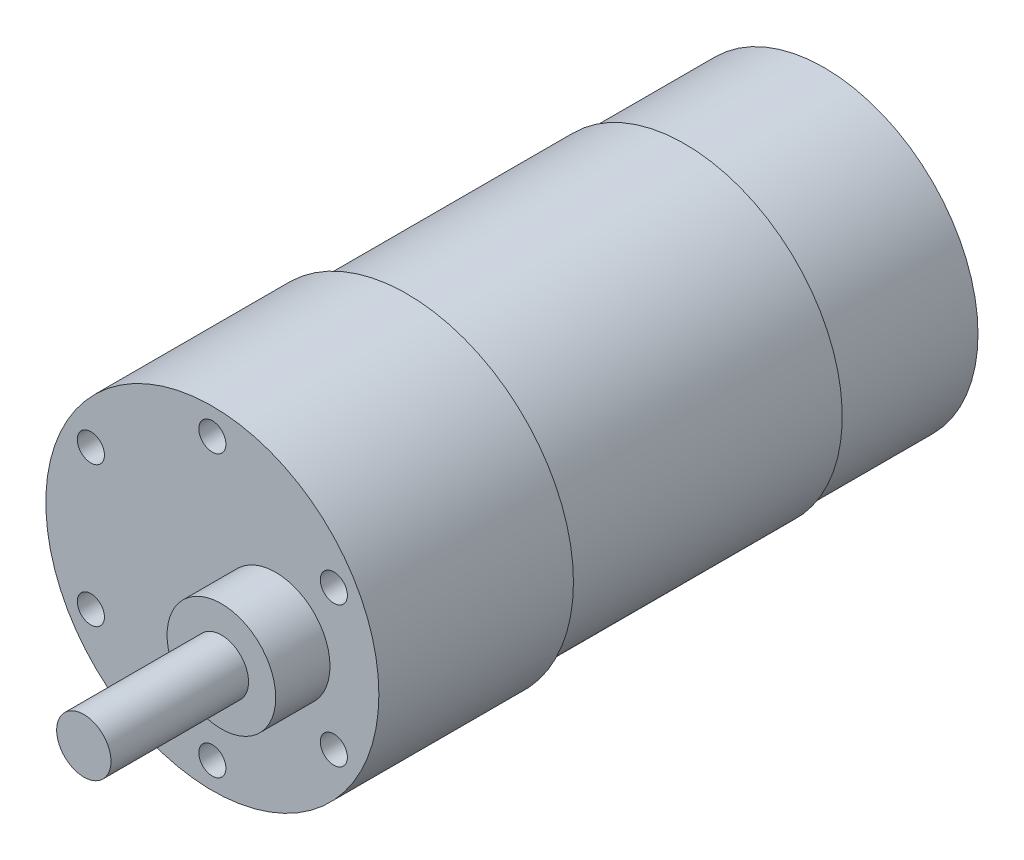
ISO-10303-21;
HEADER;
FILE_DESCRIPTION(('STEP AP214'),'2;1');
FILE_NAME('part.step','',(''),(''),'','','');
FILE_SCHEMA(('AUTOMOTIVE_DESIGN { 1 0 10303 214 1 1 1 1 }'));
ENDSEC;
DATA;
#1=APPLICATION_CONTEXT('core data for automotive mechanical design processes');
#2=APPLICATION_PROTOCOL_DEFINITION('international standard','automotive_design',2000,#1);
#3=PRODUCT_CONTEXT('',#1,'mechanical');
#4=PRODUCT('Part','Part','',(#3));
#5=PRODUCT_RELATED_PRODUCT_CATEGORY('part','',(#4));
#6=PRODUCT_DEFINITION_FORMATION('','',#4);
#7=PRODUCT_DEFINITION_CONTEXT('part definition',#1,'design');
#8=PRODUCT_DEFINITION('design','',#6,#7);
#9=PRODUCT_DEFINITION_SHAPE('','',#8);
#10=(LENGTH_UNIT() NAMED_UNIT(*) SI_UNIT(.MILLI.,.METRE.));
#11=(NAMED_UNIT(*) PLANE_ANGLE_UNIT() SI_UNIT($,.RADIAN.));
#12=(NAMED_UNIT(*) SI_UNIT($,.STERADIAN.) SOLID_ANGLE_UNIT());
#13=UNCERTAINTY_MEASURE_WITH_UNIT(LENGTH_MEASURE(1.E-05),#10,'distance_accuracy_value','');
#14=(GEOMETRIC_REPRESENTATION_CONTEXT(3) GLOBAL_UNCERTAINTY_ASSIGNED_CONTEXT((#13)) GLOBAL_UNIT_ASSIGNED_CONTEXT((#10,
#11,#12)) REPRESENTATION_CONTEXT('',''));
#15=CARTESIAN_POINT('',(0.,0.,0.));
#16=DIRECTION('',(0.,0.,1.));
#17=DIRECTION('',(1.,0.,0.));
#18=AXIS2_PLACEMENT_3D('',#15,#16,#17);
#19=CARTESIAN_POINT('',(0.,0.,-21.5));
#20=DIRECTION('',(0.,0.,1.));
#21=DIRECTION('',(1.,0.,0.));
#22=AXIS2_PLACEMENT_3D('',#19,#20,#21);
#23=CYLINDRICAL_SURFACE('',#22,18.4);
#24=CARTESIAN_POINT('',(0.,0.,-21.5));
#25=DIRECTION('',(0.,0.,1.));
#26=DIRECTION('',(1.,0.,0.));
#27=AXIS2_PLACEMENT_3D('',#24,#25,#26);
#28=CIRCLE('',#27,18.4);
#29=CARTESIAN_POINT('',(18.4,0.,-21.5));
#30=VERTEX_POINT('',#29);
#31=EDGE_CURVE('E50',#30,#30,#28,.T.);
#32=ORIENTED_EDGE('',*,*,#31,.T.);
#33=EDGE_LOOP('',(#32));
#34=FACE_BOUND('',#33,.T.);
#35=CARTESIAN_POINT('',(0.,0.,0.));
#36=DIRECTION('',(0.,0.,1.));
#37=DIRECTION('',(1.,0.,0.));
#38=AXIS2_PLACEMENT_3D('',#35,#36,#37);
#39=CIRCLE('',#38,18.4);
#40=CARTESIAN_POINT('',(18.4,0.,0.));
#41=VERTEX_POINT('',#40);
#42=EDGE_CURVE('E65',#41,#41,#39,.T.);
#43=ORIENTED_EDGE('',*,*,#42,.F.);
#44=EDGE_LOOP('',(#43));
#45=FACE_BOUND('',#44,.T.);
#46=ADVANCED_FACE('F38',(#34,#45),#23,.T.);
#47=CARTESIAN_POINT('',(0.,0.,-21.5));
#48=DIRECTION('',(0.,0.,1.));
#49=DIRECTION('',(1.,0.,0.));
#50=AXIS2_PLACEMENT_3D('',#47,#48,#49);
#51=PLANE('',#50);
#52=CARTESIAN_POINT('',(0.,0.,-21.5));
#53=DIRECTION('',(0.,0.,-1.));
#54=DIRECTION('',(-1.,0.,0.));
#55=AXIS2_PLACEMENT_3D('',#52,#53,#54);
#56=CIRCLE('',#55,17.4);
#57=CARTESIAN_POINT('',(-17.4,0.,-21.5));
#58=VERTEX_POINT('',#57);
#59=EDGE_CURVE('E45',#58,#58,#56,.T.);
#60=ORIENTED_EDGE('',*,*,#59,.F.);
#61=EDGE_LOOP('',(#60));
#62=FACE_BOUND('',#61,.T.);
#63=ORIENTED_EDGE('',*,*,#31,.F.);
#64=EDGE_LOOP('',(#63));
#65=FACE_BOUND('',#64,.T.);
#66=ADVANCED_FACE('F76',(#62,#65),#51,.F.);
#67=CARTESIAN_POINT('',(0.,0.,0.));
#68=DIRECTION('',(0.,0.,1.));
#69=DIRECTION('',(1.,0.,0.));
#70=AXIS2_PLACEMENT_3D('',#67,#68,#69);
#71=PLANE('',#70);
#72=CARTESIAN_POINT('',(1.75645137706901E-12,-15.5,0.));
#73=DIRECTION('',(0.,0.,1.));
#74=DIRECTION('',(1.,0.,0.));
#75=AXIS2_PLACEMENT_3D('',#72,#73,#74);
#76=CIRCLE('',#75,1.50000000000178);
#77=CARTESIAN_POINT('',(1.50000000000354,-15.5,0.));
#78=VERTEX_POINT('',#77);
#79=EDGE_CURVE('E204',#78,#78,#76,.T.);
#80=ORIENTED_EDGE('',*,*,#79,.F.);
#81=EDGE_LOOP('',(#80));
#82=FACE_BOUND('',#81,.T.);
#83=CARTESIAN_POINT('',(13.4233937586601,-7.74999999999924,0.));
#84=DIRECTION('',(0.,0.,1.));
#85=DIRECTION('',(1.,0.,0.));
#86=AXIS2_PLACEMENT_3D('',#83,#84,#85);
#87=CIRCLE('',#86,1.50000000000111);
#88=CARTESIAN_POINT('',(14.9233937586612,-7.74999999999924,0.));
#89=VERTEX_POINT('',#88);
#90=EDGE_CURVE('E198',#89,#89,#87,.T.);
#91=ORIENTED_EDGE('',*,*,#90,.F.);
#92=EDGE_LOOP('',(#91));
#93=FACE_BOUND('',#92,.T.);
#94=CARTESIAN_POINT('',(13.4233937586592,7.75000000000076,0.));
#95=DIRECTION('',(0.,0.,1.));
#96=DIRECTION('',(1.,0.,0.));
#97=AXIS2_PLACEMENT_3D('',#94,#95,#96);
#98=CIRCLE('',#97,1.50000000000024);
#99=CARTESIAN_POINT('',(14.9233937586595,7.75000000000076,0.));
#100=VERTEX_POINT('',#99);
#101=EDGE_CURVE('E192',#100,#100,#98,.T.);
#102=ORIENTED_EDGE('',*,*,#101,.F.);
#103=EDGE_LOOP('',(#102));
#104=FACE_BOUND('',#103,.T.);
#105=CARTESIAN_POINT('',(0.,15.5,0.));
#106=DIRECTION('',(0.,0.,1.));
#107=DIRECTION('',(1.,0.,0.));
#108=AXIS2_PLACEMENT_3D('',#105,#106,#107);
#109=CIRCLE('',#108,1.5);
#110=CARTESIAN_POINT('',(1.5,15.5,0.));
#111=VERTEX_POINT('',#110);
#112=EDGE_CURVE('E184',#111,#111,#109,.T.);
#113=ORIENTED_EDGE('',*,*,#112,.F.);
#114=EDGE_LOOP('',(#113));
#115=FACE_BOUND('',#114,.T.);
#116=CARTESIAN_POINT('',(-13.4233937586584,7.74999999999923,0.));
#117=DIRECTION('',(0.,0.,1.));
#118=DIRECTION('',(1.,0.,0.));
#119=AXIS2_PLACEMENT_3D('',#116,#117,#118);
#120=CIRCLE('',#119,1.50000000000083);
#121=CARTESIAN_POINT('',(-11.9233937586575,7.74999999999923,0.));
#122=VERTEX_POINT('',#121);
#123=EDGE_CURVE('E178',#122,#122,#120,.T.);
#124=ORIENTED_EDGE('',*,*,#123,.F.);
#125=EDGE_LOOP('',(#124));
#126=FACE_BOUND('',#125,.T.);
#127=CARTESIAN_POINT('',(-13.4233937586575,-7.75000000000077,0.));
#128=DIRECTION('',(0.,0.,1.));
#129=DIRECTION('',(1.,0.,0.));
#130=AXIS2_PLACEMENT_3D('',#127,#128,#129);
#131=CIRCLE('',#130,1.50000000000163);
#132=CARTESIAN_POINT('',(-11.9233937586559,-7.75000000000077,0.));
#133=VERTEX_POINT('',#132);
#134=EDGE_CURVE('E180',#133,#133,#131,.T.);
#135=ORIENTED_EDGE('',*,*,#134,.F.);
#136=EDGE_LOOP('',(#135));
#137=FACE_BOUND('',#136,.T.);
#138=CARTESIAN_POINT('',(7.,0.,0.));
#139=DIRECTION('',(0.,0.,1.));
#140=DIRECTION('',(1.,0.,0.));
#141=AXIS2_PLACEMENT_3D('',#138,#139,#140);
#142=CIRCLE('',#141,6.);
#143=CARTESIAN_POINT('',(13.,0.,0.));
#144=VERTEX_POINT('',#143);
#145=EDGE_CURVE('E66',#144,#144,#142,.T.);
#146=ORIENTED_EDGE('',*,*,#145,.F.);
#147=EDGE_LOOP('',(#146));
#148=FACE_BOUND('',#147,.T.);
#149=ORIENTED_EDGE('',*,*,#42,.T.);
#150=EDGE_LOOP('',(#149));
#151=FACE_BOUND('',#150,.T.);
#152=ADVANCED_FACE('F73',(#82,#93,#104,#115,#126,#137,#148,#151),#71,.T.);
#153=CARTESIAN_POINT('',(7.,0.,6.));
#154=DIRECTION('',(0.,0.,-1.));
#155=DIRECTION('',(-1.,0.,0.));
#156=AXIS2_PLACEMENT_3D('',#153,#154,#155);
#157=CYLINDRICAL_SURFACE('',#156,6.);
#158=CARTESIAN_POINT('',(7.,0.,6.));
#159=DIRECTION('',(0.,0.,1.));
#160=DIRECTION('',(1.,0.,0.));
#161=AXIS2_PLACEMENT_3D('',#158,#159,#160);
#162=CIRCLE('',#161,6.);
#163=CARTESIAN_POINT('',(13.,0.,6.));
#164=VERTEX_POINT('',#163);
#165=EDGE_CURVE('E62',#164,#164,#162,.T.);
#166=ORIENTED_EDGE('',*,*,#165,.F.);
#167=EDGE_LOOP('',(#166));
#168=FACE_BOUND('',#167,.T.);
#169=ORIENTED_EDGE('',*,*,#145,.T.);
#170=EDGE_LOOP('',(#169));
#171=FACE_BOUND('',#170,.T.);
#172=ADVANCED_FACE('F88',(#168,#171),#157,.T.);
#173=CARTESIAN_POINT('',(7.,0.,6.));
#174=DIRECTION('',(0.,0.,1.));
#175=DIRECTION('',(1.,0.,0.));
#176=AXIS2_PLACEMENT_3D('',#173,#174,#175);
#177=PLANE('',#176);
#178=CARTESIAN_POINT('',(7.,0.,6.));
#179=DIRECTION('',(0.,0.,1.));
#180=DIRECTION('',(1.,0.,0.));
#181=AXIS2_PLACEMENT_3D('',#178,#179,#180);
#182=CIRCLE('',#181,3.);
#183=CARTESIAN_POINT('',(10.,0.,6.));
#184=VERTEX_POINT('',#183);
#185=EDGE_CURVE('E41',#184,#184,#182,.F.);
#186=ORIENTED_EDGE('',*,*,#185,.T.);
#187=EDGE_LOOP('',(#186));
#188=FACE_BOUND('',#187,.T.);
#189=ORIENTED_EDGE('',*,*,#165,.T.);
#190=EDGE_LOOP('',(#189));
#191=FACE_BOUND('',#190,.T.);
#192=ADVANCED_FACE('F94',(#188,#191),#177,.T.);
#193=CARTESIAN_POINT('',(7.,0.,21.2));
#194=DIRECTION('',(0.,0.,-1.));
#195=DIRECTION('',(-1.,0.,0.));
#196=AXIS2_PLACEMENT_3D('',#193,#194,#195);
#197=CYLINDRICAL_SURFACE('',#196,3.);
#198=ORIENTED_EDGE('',*,*,#185,.F.);
#199=EDGE_LOOP('',(#198));
#200=FACE_BOUND('',#199,.T.);
#201=CARTESIAN_POINT('',(7.,0.,21.2));
#202=DIRECTION('',(0.,0.,1.));
#203=DIRECTION('',(1.,0.,0.));
#204=AXIS2_PLACEMENT_3D('',#201,#202,#203);
#205=CIRCLE('',#204,3.);
#206=CARTESIAN_POINT('',(10.,0.,21.2));
#207=VERTEX_POINT('',#206);
#208=EDGE_CURVE('E58',#207,#207,#205,.T.);
#209=ORIENTED_EDGE('',*,*,#208,.F.);
#210=EDGE_LOOP('',(#209));
#211=FACE_BOUND('',#210,.T.);
#212=ADVANCED_FACE('F98',(#200,#211),#197,.T.);
#213=CARTESIAN_POINT('',(7.,0.,21.2));
#214=DIRECTION('',(0.,0.,1.));
#215=DIRECTION('',(1.,0.,0.));
#216=AXIS2_PLACEMENT_3D('',#213,#214,#215);
#217=PLANE('',#216);
#218=ORIENTED_EDGE('',*,*,#208,.T.);
#219=EDGE_LOOP('',(#218));
#220=FACE_BOUND('',#219,.T.);
#221=ADVANCED_FACE('F102',(#220),#217,.T.);
#222=CARTESIAN_POINT('',(0.,0.,-52.2));
#223=DIRECTION('',(0.,0.,1.));
#224=DIRECTION('',(1.,0.,0.));
#225=AXIS2_PLACEMENT_3D('',#222,#223,#224);
#226=CYLINDRICAL_SURFACE('',#225,17.4);
#227=CARTESIAN_POINT('',(0.,0.,-52.2));
#228=DIRECTION('',(0.,0.,-1.));
#229=DIRECTION('',(-1.,0.,0.));
#230=AXIS2_PLACEMENT_3D('',#227,#228,#229);
#231=CIRCLE('',#230,17.4);
#232=CARTESIAN_POINT('',(-17.4,0.,-52.2));
#233=VERTEX_POINT('',#232);
#234=EDGE_CURVE('E56',#233,#233,#231,.T.);
#235=ORIENTED_EDGE('',*,*,#234,.F.);
#236=EDGE_LOOP('',(#235));
#237=FACE_BOUND('',#236,.T.);
#238=ORIENTED_EDGE('',*,*,#59,.T.);
#239=EDGE_LOOP('',(#238));
#240=FACE_BOUND('',#239,.T.);
#241=ADVANCED_FACE('F106',(#237,#240),#226,.T.);
#242=CARTESIAN_POINT('',(0.,0.,-52.2));
#243=DIRECTION('',(0.,0.,-1.));
#244=DIRECTION('',(-1.,0.,0.));
#245=AXIS2_PLACEMENT_3D('',#242,#243,#244);
#246=PLANE('',#245);
#247=CARTESIAN_POINT('',(0.,0.,-52.2));
#248=DIRECTION('',(0.,0.,-1.));
#249=DIRECTION('',(-1.,0.,0.));
#250=AXIS2_PLACEMENT_3D('',#247,#248,#249);
#251=CIRCLE('',#250,17.);
#252=CARTESIAN_POINT('',(17.,0.,-52.2));
#253=VERTEX_POINT('',#252);
#254=EDGE_CURVE('E10',#253,#253,#251,.T.);
#255=ORIENTED_EDGE('',*,*,#254,.F.);
#256=EDGE_LOOP('',(#255));
#257=FACE_BOUND('',#256,.T.);
#258=ORIENTED_EDGE('',*,*,#234,.T.);
#259=EDGE_LOOP('',(#258));
#260=FACE_BOUND('',#259,.T.);
#261=ADVANCED_FACE('F110',(#257,#260),#246,.T.);
#262=CARTESIAN_POINT('',(0.,0.,-67.6));
#263=DIRECTION('',(0.,0.,1.));
#264=DIRECTION('',(1.,0.,0.));
#265=AXIS2_PLACEMENT_3D('',#262,#263,#264);
#266=CYLINDRICAL_SURFACE('',#265,17.);
#267=CARTESIAN_POINT('',(0.,0.,-67.6));
#268=DIRECTION('',(0.,0.,-1.));
#269=DIRECTION('',(-1.,0.,0.));
#270=AXIS2_PLACEMENT_3D('',#267,#268,#269);
#271=CIRCLE('',#270,17.);
#272=CARTESIAN_POINT('',(17.,0.,-67.6));
#273=VERTEX_POINT('',#272);
#274=EDGE_CURVE('E54',#273,#273,#271,.T.);
#275=CARTESIAN_POINT('',(17.,0.,-67.6));
#276=CARTESIAN_POINT('',(17.,0.,-67.4395833333333));
#277=CARTESIAN_POINT('',(17.,0.,-67.2791666666667));
#278=CARTESIAN_POINT('',(17.,0.,-66.9583333333333));
#279=CARTESIAN_POINT('',(17.,0.,-66.7979166666667));
#280=CARTESIAN_POINT('',(17.,0.,-66.4770833333333));
#281=CARTESIAN_POINT('',(17.,0.,-66.3166666666666));
#282=CARTESIAN_POINT('',(17.,0.,-65.9958333333333));
#283=CARTESIAN_POINT('',(17.,0.,-65.8354166666666));
#284=CARTESIAN_POINT('',(17.,0.,-65.5145833333333));
#285=CARTESIAN_POINT('',(17.,0.,-65.3541666666666));
#286=CARTESIAN_POINT('',(17.,0.,-65.0333333333333));
#287=CARTESIAN_POINT('',(17.,0.,-64.8729166666667));
#288=CARTESIAN_POINT('',(17.,0.,-64.5520833333333));
#289=CARTESIAN_POINT('',(17.,0.,-64.3916666666667));
#290=CARTESIAN_POINT('',(17.,0.,-64.0708333333333));
#291=CARTESIAN_POINT('',(17.,0.,-63.9104166666666));
#292=CARTESIAN_POINT('',(17.,0.,-63.5895833333333));
#293=CARTESIAN_POINT('',(17.,0.,-63.4291666666666));
#294=CARTESIAN_POINT('',(17.,0.,-63.1083333333333));
#295=CARTESIAN_POINT('',(17.,0.,-62.9479166666666));
#296=CARTESIAN_POINT('',(17.,0.,-62.6270833333333));
#297=CARTESIAN_POINT('',(17.,0.,-62.4666666666666));
#298=CARTESIAN_POINT('',(17.,0.,-62.1458333333333));
#299=CARTESIAN_POINT('',(17.,0.,-61.9854166666667));
#300=CARTESIAN_POINT('',(17.,0.,-61.6645833333333));
#301=CARTESIAN_POINT('',(17.,0.,-61.5041666666667));
#302=CARTESIAN_POINT('',(17.,0.,-61.1833333333333));
#303=CARTESIAN_POINT('',(17.,0.,-61.0229166666667));
#304=CARTESIAN_POINT('',(17.,0.,-60.7020833333333));
#305=CARTESIAN_POINT('',(17.,0.,-60.5416666666667));
#306=CARTESIAN_POINT('',(17.,0.,-60.2208333333333));
#307=CARTESIAN_POINT('',(17.,0.,-60.0604166666667));
#308=CARTESIAN_POINT('',(17.,0.,-59.7395833333333));
#309=CARTESIAN_POINT('',(17.,0.,-59.5791666666667));
#310=CARTESIAN_POINT('',(17.,0.,-59.2583333333333));
#311=CARTESIAN_POINT('',(17.,0.,-59.0979166666667));
#312=CARTESIAN_POINT('',(17.,0.,-58.7770833333333));
#313=CARTESIAN_POINT('',(17.,0.,-58.6166666666667));
#314=CARTESIAN_POINT('',(17.,0.,-58.2958333333333));
#315=CARTESIAN_POINT('',(17.,0.,-58.1354166666667));
#316=CARTESIAN_POINT('',(17.,0.,-57.8145833333333));
#317=CARTESIAN_POINT('',(17.,0.,-57.6541666666667));
#318=CARTESIAN_POINT('',(17.,0.,-57.3333333333333));
#319=CARTESIAN_POINT('',(17.,0.,-57.1729166666667));
#320=CARTESIAN_POINT('',(17.,0.,-56.8520833333333));
#321=CARTESIAN_POINT('',(17.,0.,-56.6916666666667));
#322=CARTESIAN_POINT('',(17.,0.,-56.3708333333333));
#323=CARTESIAN_POINT('',(17.,0.,-56.2104166666667));
#324=CARTESIAN_POINT('',(17.,0.,-55.8895833333333));
#325=CARTESIAN_POINT('',(17.,0.,-55.7291666666667));
#326=CARTESIAN_POINT('',(17.,0.,-55.4083333333333));
#327=CARTESIAN_POINT('',(17.,0.,-55.2479166666667));
#328=CARTESIAN_POINT('',(17.,0.,-54.9270833333333));
#329=CARTESIAN_POINT('',(17.,0.,-54.7666666666667));
#330=CARTESIAN_POINT('',(17.,0.,-54.4458333333333));
#331=CARTESIAN_POINT('',(17.,0.,-54.2854166666667));
#332=CARTESIAN_POINT('',(17.,0.,-53.9645833333333));
#333=CARTESIAN_POINT('',(17.,0.,-53.8041666666667));
#334=CARTESIAN_POINT('',(17.,0.,-53.4833333333333));
#335=CARTESIAN_POINT('',(17.,0.,-53.3229166666667));
#336=CARTESIAN_POINT('',(17.,0.,-53.0020833333333));
#337=CARTESIAN_POINT('',(17.,0.,-52.8416666666667));
#338=CARTESIAN_POINT('',(17.,0.,-52.5208333333333));
#339=CARTESIAN_POINT('',(17.,0.,-52.3604166666667));
#340=CARTESIAN_POINT('',(17.,0.,-52.2));
#341=B_SPLINE_CURVE_WITH_KNOTS('',3,(#275,#276,#277,#278,#279,#280,#281,#282,#283,#284,#285,
#286,#287,#288,#289,#290,#291,#292,#293,#294,#295,#296,#297,#298,#299,#300,#301,#302,#303,#304,
#305,#306,#307,#308,#309,#310,#311,#312,#313,#314,#315,#316,#317,#318,#319,#320,#321,#322,#323,
#324,#325,#326,#327,#328,#329,#330,#331,#332,#333,#334,#335,#336,#337,#338,#339,#340),
.UNSPECIFIED.,.F.,.F.,(4,2,2,2,2,2,2,2,2,2,2,2,2,2,2,2,2,2,2,2,2,2,2,2,2,2,2,2,2,2,2,2,4),(0.,
0.481250000000003,0.962500000000005,1.44375000000001,1.92500000000001,2.40625000000001,2.8875,
3.36875,3.85000000000001,4.33125000000001,4.81250000000001,5.29375000000001,5.775,6.25625,
6.73750000000001,7.21875,7.70000000000001,8.18125,8.6625,9.14375000000001,9.625,10.10625,
10.5875,11.06875,11.55,12.03125,12.5125,12.99375,13.475,13.95625,14.4375,14.91875,15.4),.UNSPECIFIED.);
#342=EDGE_CURVE('BSEAM114',#273,#253,#341,.T.);
#343=ORIENTED_EDGE('',*,*,#274,.F.);
#344=ORIENTED_EDGE('',*,*,#254,.T.);
#345=ORIENTED_EDGE('',*,*,#342,.T.);
#346=ORIENTED_EDGE('',*,*,#342,.F.);
#347=EDGE_LOOP('',(#343,#345,#344,#346));
#348=FACE_BOUND('',#347,.T.);
#349=ADVANCED_FACE('F114',(#348),#266,.T.);
#350=CARTESIAN_POINT('',(0.,0.,-67.6));
#351=DIRECTION('',(0.,0.,-1.));
#352=DIRECTION('',(-1.,0.,0.));
#353=AXIS2_PLACEMENT_3D('',#350,#351,#352);
#354=PLANE('',#353);
#355=ORIENTED_EDGE('',*,*,#274,.T.);
#356=EDGE_LOOP('',(#355));
#357=FACE_BOUND('',#356,.T.);
#358=ADVANCED_FACE('F118',(#357),#354,.T.);
#359=CARTESIAN_POINT('',(-13.4233937586575,-7.75000000000077,-5.));
#360=DIRECTION('',(0.,0.,1.));
#361=DIRECTION('',(1.,0.,0.));
#362=AXIS2_PLACEMENT_3D('',#359,#360,#361);
#363=CYLINDRICAL_SURFACE('',#362,1.50000000000163);
#364=CARTESIAN_POINT('',(-13.4233937586575,-7.75000000000077,-5.));
#365=DIRECTION('',(0.,0.,1.));
#366=DIRECTION('',(1.,0.,0.));
#367=AXIS2_PLACEMENT_3D('',#364,#365,#366);
#368=CIRCLE('',#367,1.50000000000163);
#369=CARTESIAN_POINT('',(-11.9233937586559,-7.75000000000077,-5.));
#370=VERTEX_POINT('',#369);
#371=EDGE_CURVE('E183',#370,#370,#368,.T.);
#372=ORIENTED_EDGE('',*,*,#371,.F.);
#373=EDGE_LOOP('',(#372));
#374=FACE_BOUND('',#373,.T.);
#375=ORIENTED_EDGE('',*,*,#134,.T.);
#376=EDGE_LOOP('',(#375));
#377=FACE_BOUND('',#376,.T.);
#378=ADVANCED_FACE('F122',(#374,#377),#363,.F.);
#379=CARTESIAN_POINT('',(0.,0.,-5.));
#380=DIRECTION('',(0.,0.,1.));
#381=DIRECTION('',(1.,0.,0.));
#382=AXIS2_PLACEMENT_3D('',#379,#380,#381);
#383=PLANE('',#382);
#384=ORIENTED_EDGE('',*,*,#371,.T.);
#385=EDGE_LOOP('',(#384));
#386=FACE_BOUND('',#385,.T.);
#387=ADVANCED_FACE('F126',(#386),#383,.T.);
#388=CARTESIAN_POINT('',(-13.4233937586584,7.74999999999923,-5.));
#389=DIRECTION('',(0.,0.,1.));
#390=DIRECTION('',(1.,0.,0.));
#391=AXIS2_PLACEMENT_3D('',#388,#389,#390);
#392=CYLINDRICAL_SURFACE('',#391,1.50000000000083);
#393=CARTESIAN_POINT('',(-13.4233937586584,7.74999999999923,-5.));
#394=DIRECTION('',(0.,0.,1.));
#395=DIRECTION('',(1.,0.,0.));
#396=AXIS2_PLACEMENT_3D('',#393,#394,#395);
#397=CIRCLE('',#396,1.50000000000083);
#398=CARTESIAN_POINT('',(-11.9233937586575,7.74999999999923,-5.));
#399=VERTEX_POINT('',#398);
#400=EDGE_CURVE('E175',#399,#399,#397,.T.);
#401=ORIENTED_EDGE('',*,*,#400,.F.);
#402=EDGE_LOOP('',(#401));
#403=FACE_BOUND('',#402,.T.);
#404=ORIENTED_EDGE('',*,*,#123,.T.);
#405=EDGE_LOOP('',(#404));
#406=FACE_BOUND('',#405,.T.);
#407=ADVANCED_FACE('F130',(#403,#406),#392,.F.);
#408=CARTESIAN_POINT('',(0.,0.,-5.));
#409=DIRECTION('',(0.,0.,1.));
#410=DIRECTION('',(1.,0.,0.));
#411=AXIS2_PLACEMENT_3D('',#408,#409,#410);
#412=PLANE('',#411);
#413=ORIENTED_EDGE('',*,*,#400,.T.);
#414=EDGE_LOOP('',(#413));
#415=FACE_BOUND('',#414,.T.);
#416=ADVANCED_FACE('F163',(#415),#412,.T.);
#417=CARTESIAN_POINT('',(0.,15.5,-5.));
#418=DIRECTION('',(0.,0.,1.));
#419=DIRECTION('',(1.,0.,0.));
#420=AXIS2_PLACEMENT_3D('',#417,#418,#419);
#421=CYLINDRICAL_SURFACE('',#420,1.5);
#422=CARTESIAN_POINT('',(0.,15.5,-5.));
#423=DIRECTION('',(0.,0.,1.));
#424=DIRECTION('',(1.,0.,0.));
#425=AXIS2_PLACEMENT_3D('',#422,#423,#424);
#426=CIRCLE('',#425,1.5);
#427=CARTESIAN_POINT('',(1.5,15.5,-5.));
#428=VERTEX_POINT('',#427);
#429=EDGE_CURVE('E189',#428,#428,#426,.T.);
#430=ORIENTED_EDGE('',*,*,#429,.F.);
#431=EDGE_LOOP('',(#430));
#432=FACE_BOUND('',#431,.T.);
#433=ORIENTED_EDGE('',*,*,#112,.T.);
#434=EDGE_LOOP('',(#433));
#435=FACE_BOUND('',#434,.T.);
#436=ADVANCED_FACE('F159',(#432,#435),#421,.F.);
#437=CARTESIAN_POINT('',(0.,0.,-5.));
#438=DIRECTION('',(0.,0.,1.));
#439=DIRECTION('',(1.,0.,0.));
#440=AXIS2_PLACEMENT_3D('',#437,#438,#439);
#441=PLANE('',#440);
#442=ORIENTED_EDGE('',*,*,#429,.T.);
#443=EDGE_LOOP('',(#442));
#444=FACE_BOUND('',#443,.T.);
#445=ADVANCED_FACE('F155',(#444),#441,.T.);
#446=CARTESIAN_POINT('',(13.4233937586592,7.75000000000076,-5.));
#447=DIRECTION('',(0.,0.,1.));
#448=DIRECTION('',(1.,0.,0.));
#449=AXIS2_PLACEMENT_3D('',#446,#447,#448);
#450=CYLINDRICAL_SURFACE('',#449,1.50000000000024);
#451=CARTESIAN_POINT('',(13.4233937586592,7.75000000000076,-5.));
#452=DIRECTION('',(0.,0.,1.));
#453=DIRECTION('',(1.,0.,0.));
#454=AXIS2_PLACEMENT_3D('',#451,#452,#453);
#455=CIRCLE('',#454,1.50000000000024);
#456=CARTESIAN_POINT('',(14.9233937586595,7.75000000000076,-5.));
#457=VERTEX_POINT('',#456);
#458=EDGE_CURVE('E195',#457,#457,#455,.T.);
#459=ORIENTED_EDGE('',*,*,#458,.F.);
#460=EDGE_LOOP('',(#459));
#461=FACE_BOUND('',#460,.T.);
#462=ORIENTED_EDGE('',*,*,#101,.T.);
#463=EDGE_LOOP('',(#462));
#464=FACE_BOUND('',#463,.T.);
#465=ADVANCED_FACE('F151',(#461,#464),#450,.F.);
#466=CARTESIAN_POINT('',(0.,0.,-5.));
#467=DIRECTION('',(0.,0.,1.));
#468=DIRECTION('',(1.,0.,0.));
#469=AXIS2_PLACEMENT_3D('',#466,#467,#468);
#470=PLANE('',#469);
#471=ORIENTED_EDGE('',*,*,#458,.T.);
#472=EDGE_LOOP('',(#471));
#473=FACE_BOUND('',#472,.T.);
#474=ADVANCED_FACE('F147',(#473),#470,.T.);
#475=CARTESIAN_POINT('',(13.4233937586601,-7.74999999999924,-5.));
#476=DIRECTION('',(0.,0.,1.));
#477=DIRECTION('',(1.,0.,0.));
#478=AXIS2_PLACEMENT_3D('',#475,#476,#477);
#479=CYLINDRICAL_SURFACE('',#478,1.50000000000111);
#480=CARTESIAN_POINT('',(13.4233937586601,-7.74999999999924,-5.));
#481=DIRECTION('',(0.,0.,1.));
#482=DIRECTION('',(1.,0.,0.));
#483=AXIS2_PLACEMENT_3D('',#480,#481,#482);
#484=CIRCLE('',#483,1.50000000000111);
#485=CARTESIAN_POINT('',(14.9233937586612,-7.74999999999924,-5.));
#486=VERTEX_POINT('',#485);
#487=EDGE_CURVE('E201',#486,#486,#484,.T.);
#488=ORIENTED_EDGE('',*,*,#487,.F.);
#489=EDGE_LOOP('',(#488));
#490=FACE_BOUND('',#489,.T.);
#491=ORIENTED_EDGE('',*,*,#90,.T.);
#492=EDGE_LOOP('',(#491));
#493=FACE_BOUND('',#492,.T.);
#494=ADVANCED_FACE('F143',(#490,#493),#479,.F.);
#495=CARTESIAN_POINT('',(0.,0.,-5.));
#496=DIRECTION('',(0.,0.,1.));
#497=DIRECTION('',(1.,0.,0.));
#498=AXIS2_PLACEMENT_3D('',#495,#496,#497);
#499=PLANE('',#498);
#500=ORIENTED_EDGE('',*,*,#487,.T.);
#501=EDGE_LOOP('',(#500));
#502=FACE_BOUND('',#501,.T.);
#503=ADVANCED_FACE('F139',(#502),#499,.T.);
#504=CARTESIAN_POINT('',(1.75645137706901E-12,-15.5,-5.));
#505=DIRECTION('',(0.,0.,1.));
#506=DIRECTION('',(1.,0.,0.));
#507=AXIS2_PLACEMENT_3D('',#504,#505,#506);
#508=CYLINDRICAL_SURFACE('',#507,1.50000000000178);
#509=CARTESIAN_POINT('',(1.75645137706901E-12,-15.5,-5.));
#510=DIRECTION('',(0.,0.,1.));
#511=DIRECTION('',(1.,0.,0.));
#512=AXIS2_PLACEMENT_3D('',#509,#510,#511);
#513=CIRCLE('',#512,1.50000000000178);
#514=CARTESIAN_POINT('',(1.50000000000354,-15.5,-5.));
#515=VERTEX_POINT('',#514);
#516=EDGE_CURVE('E207',#515,#515,#513,.T.);
#517=ORIENTED_EDGE('',*,*,#516,.F.);
#518=EDGE_LOOP('',(#517));
#519=FACE_BOUND('',#518,.T.);
#520=ORIENTED_EDGE('',*,*,#79,.T.);
#521=EDGE_LOOP('',(#520));
#522=FACE_BOUND('',#521,.T.);
#523=ADVANCED_FACE('F135',(#519,#522),#508,.F.);
#524=CARTESIAN_POINT('',(1.75645137706901E-12,-15.5,-5.));
#525=DIRECTION('',(0.,0.,1.));
#526=DIRECTION('',(1.,0.,0.));
#527=AXIS2_PLACEMENT_3D('',#524,#525,#526);
#528=PLANE('',#527);
#529=ORIENTED_EDGE('',*,*,#516,.T.);
#530=EDGE_LOOP('',(#529));
#531=FACE_BOUND('',#530,.T.);
#532=ADVANCED_FACE('F132',(#531),#528,.T.);
#533=CLOSED_SHELL('',(#46,#66,#152,#172,#192,#212,#221,#241,#261,#349,#358,#378,#387,#407,#416,
#436,#445,#465,#474,#494,#503,#523,#532));
#534=MANIFOLD_SOLID_BREP('B2',#533);
#535=ADVANCED_BREP_SHAPE_REPRESENTATION('',(#18,#534),#14);
#536=SHAPE_DEFINITION_REPRESENTATION(#9,#535);
ENDSEC;
END-ISO-10303-21;
